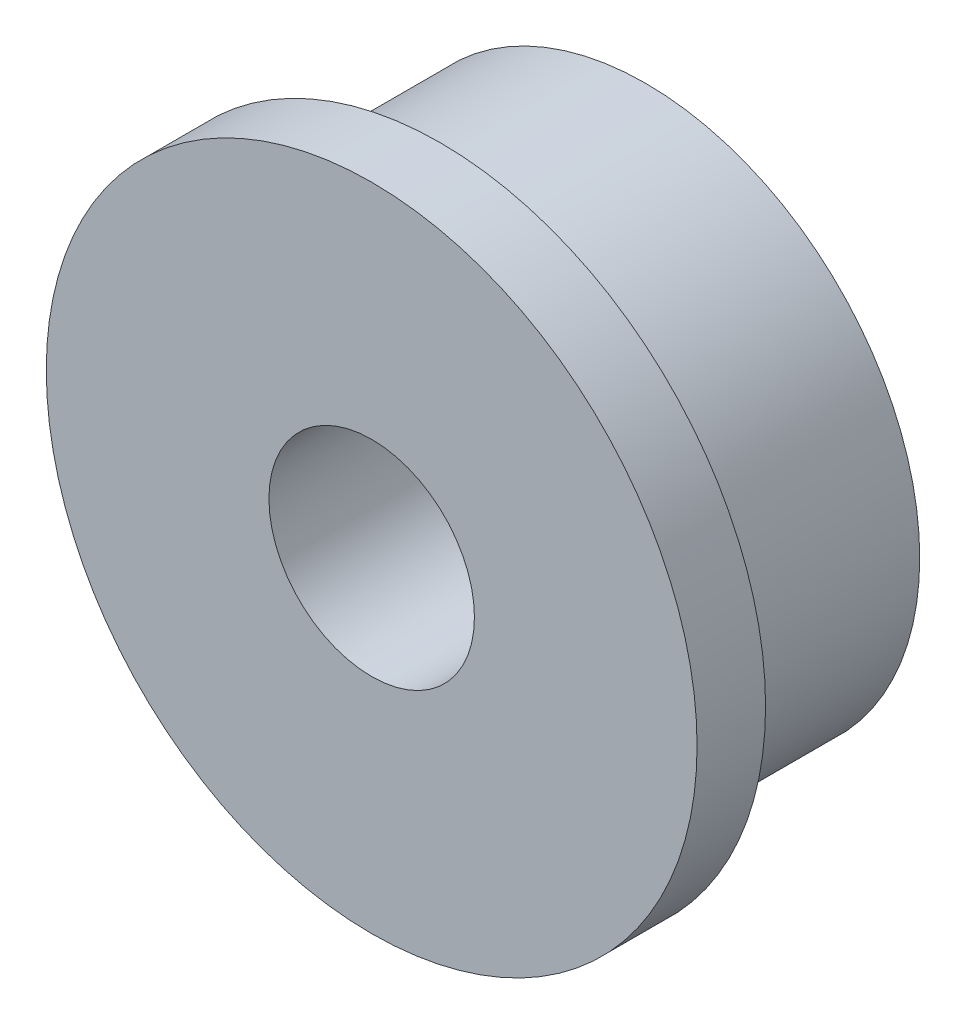
ISO-10303-21;
HEADER;
FILE_DESCRIPTION(('STEP AP214'),'2;1');
FILE_NAME('part.step','',(''),(''),'','','');
FILE_SCHEMA(('AUTOMOTIVE_DESIGN { 1 0 10303 214 1 1 1 1 }'));
ENDSEC;
DATA;
#1=APPLICATION_CONTEXT('core data for automotive mechanical design processes');
#2=APPLICATION_PROTOCOL_DEFINITION('international standard','automotive_design',2000,#1);
#3=PRODUCT_CONTEXT('',#1,'mechanical');
#4=PRODUCT('Part','Part','',(#3));
#5=PRODUCT_RELATED_PRODUCT_CATEGORY('part','',(#4));
#6=PRODUCT_DEFINITION_FORMATION('','',#4);
#7=PRODUCT_DEFINITION_CONTEXT('part definition',#1,'design');
#8=PRODUCT_DEFINITION('design','',#6,#7);
#9=PRODUCT_DEFINITION_SHAPE('','',#8);
#10=(LENGTH_UNIT() NAMED_UNIT(*) SI_UNIT(.MILLI.,.METRE.));
#11=(NAMED_UNIT(*) PLANE_ANGLE_UNIT() SI_UNIT($,.RADIAN.));
#12=(NAMED_UNIT(*) SI_UNIT($,.STERADIAN.) SOLID_ANGLE_UNIT());
#13=UNCERTAINTY_MEASURE_WITH_UNIT(LENGTH_MEASURE(1.E-05),#10,'distance_accuracy_value','');
#14=(GEOMETRIC_REPRESENTATION_CONTEXT(3) GLOBAL_UNCERTAINTY_ASSIGNED_CONTEXT((#13)) GLOBAL_UNIT_ASSIGNED_CONTEXT((#10,
#11,#12)) REPRESENTATION_CONTEXT('',''));
#15=CARTESIAN_POINT('',(0.,0.,0.));
#16=DIRECTION('',(0.,0.,1.));
#17=DIRECTION('',(1.,0.,0.));
#18=AXIS2_PLACEMENT_3D('',#15,#16,#17);
#19=CARTESIAN_POINT('',(0.,0.,0.));
#20=DIRECTION('',(0.,0.,1.));
#21=DIRECTION('',(1.,0.,0.));
#22=AXIS2_PLACEMENT_3D('',#19,#20,#21);
#23=PLANE('',#22);
#24=CARTESIAN_POINT('',(0.,0.,0.));
#25=DIRECTION('',(0.,0.,1.));
#26=DIRECTION('',(1.,0.,0.));
#27=AXIS2_PLACEMENT_3D('',#24,#25,#26);
#28=CIRCLE('',#27,4.);
#29=CARTESIAN_POINT('',(4.,0.,0.));
#30=VERTEX_POINT('',#29);
#31=EDGE_CURVE('E36',#30,#30,#28,.T.);
#32=ORIENTED_EDGE('',*,*,#31,.F.);
#33=EDGE_LOOP('',(#32));
#34=FACE_BOUND('',#33,.T.);
#35=CARTESIAN_POINT('',(0.,0.,0.));
#36=DIRECTION('',(0.,0.,1.));
#37=DIRECTION('',(1.,0.,0.));
#38=AXIS2_PLACEMENT_3D('',#35,#36,#37);
#39=CIRCLE('',#38,1.5);
#40=CARTESIAN_POINT('',(1.5,0.,0.));
#41=VERTEX_POINT('',#40);
#42=EDGE_CURVE('E43',#41,#41,#39,.T.);
#43=ORIENTED_EDGE('',*,*,#42,.T.);
#44=EDGE_LOOP('',(#43));
#45=FACE_BOUND('',#44,.T.);
#46=ADVANCED_FACE('F32',(#34,#45),#23,.F.);
#47=CARTESIAN_POINT('',(0.,0.,3.));
#48=DIRECTION('',(0.,0.,-1.));
#49=DIRECTION('',(-1.,0.,0.));
#50=AXIS2_PLACEMENT_3D('',#47,#48,#49);
#51=CYLINDRICAL_SURFACE('',#50,4.);
#52=CARTESIAN_POINT('',(0.,0.,3.));
#53=DIRECTION('',(0.,0.,1.));
#54=DIRECTION('',(1.,0.,0.));
#55=AXIS2_PLACEMENT_3D('',#52,#53,#54);
#56=CIRCLE('',#55,4.);
#57=CARTESIAN_POINT('',(4.,0.,3.));
#58=VERTEX_POINT('',#57);
#59=EDGE_CURVE('E10',#58,#58,#56,.T.);
#60=ORIENTED_EDGE('',*,*,#59,.F.);
#61=EDGE_LOOP('',(#60));
#62=FACE_BOUND('',#61,.T.);
#63=ORIENTED_EDGE('',*,*,#31,.T.);
#64=EDGE_LOOP('',(#63));
#65=FACE_BOUND('',#64,.T.);
#66=ADVANCED_FACE('F34',(#62,#65),#51,.T.);
#67=CARTESIAN_POINT('',(0.,0.,3.));
#68=DIRECTION('',(0.,0.,-1.));
#69=DIRECTION('',(-1.,0.,0.));
#70=AXIS2_PLACEMENT_3D('',#67,#68,#69);
#71=CYLINDRICAL_SURFACE('',#70,1.5);
#72=ORIENTED_EDGE('',*,*,#42,.F.);
#73=EDGE_LOOP('',(#72));
#74=FACE_BOUND('',#73,.T.);
#75=CARTESIAN_POINT('',(0.,0.,4.));
#76=DIRECTION('',(0.,0.,1.));
#77=DIRECTION('',(1.,0.,0.));
#78=AXIS2_PLACEMENT_3D('',#75,#76,#77);
#79=CIRCLE('',#78,1.5);
#80=CARTESIAN_POINT('',(1.5,0.,4.));
#81=VERTEX_POINT('',#80);
#82=EDGE_CURVE('E51',#81,#81,#79,.T.);
#83=ORIENTED_EDGE('',*,*,#82,.T.);
#84=EDGE_LOOP('',(#83));
#85=FACE_BOUND('',#84,.T.);
#86=ADVANCED_FACE('F57',(#74,#85),#71,.F.);
#87=CARTESIAN_POINT('',(0.,0.,4.));
#88=DIRECTION('',(0.,0.,1.));
#89=DIRECTION('',(1.,0.,0.));
#90=AXIS2_PLACEMENT_3D('',#87,#88,#89);
#91=PLANE('',#90);
#92=CARTESIAN_POINT('',(0.,0.,4.));
#93=DIRECTION('',(0.,0.,1.));
#94=DIRECTION('',(1.,0.,0.));
#95=AXIS2_PLACEMENT_3D('',#92,#93,#94);
#96=CIRCLE('',#95,4.75);
#97=CARTESIAN_POINT('',(4.75,0.,4.));
#98=VERTEX_POINT('',#97);
#99=EDGE_CURVE('E47',#98,#98,#96,.T.);
#100=ORIENTED_EDGE('',*,*,#99,.T.);
#101=EDGE_LOOP('',(#100));
#102=FACE_BOUND('',#101,.T.);
#103=ORIENTED_EDGE('',*,*,#82,.F.);
#104=EDGE_LOOP('',(#103));
#105=FACE_BOUND('',#104,.T.);
#106=ADVANCED_FACE('F59',(#102,#105),#91,.T.);
#107=CARTESIAN_POINT('',(0.,0.,3.));
#108=DIRECTION('',(0.,0.,1.));
#109=DIRECTION('',(1.,0.,0.));
#110=AXIS2_PLACEMENT_3D('',#107,#108,#109);
#111=PLANE('',#110);
#112=ORIENTED_EDGE('',*,*,#59,.T.);
#113=EDGE_LOOP('',(#112));
#114=FACE_BOUND('',#113,.T.);
#115=CARTESIAN_POINT('',(0.,0.,3.));
#116=DIRECTION('',(0.,0.,1.));
#117=DIRECTION('',(1.,0.,0.));
#118=AXIS2_PLACEMENT_3D('',#115,#116,#117);
#119=CIRCLE('',#118,4.75);
#120=CARTESIAN_POINT('',(4.75,0.,3.));
#121=VERTEX_POINT('',#120);
#122=EDGE_CURVE('E48',#121,#121,#119,.T.);
#123=ORIENTED_EDGE('',*,*,#122,.F.);
#124=EDGE_LOOP('',(#123));
#125=FACE_BOUND('',#124,.T.);
#126=ADVANCED_FACE('F61',(#114,#125),#111,.F.);
#127=CARTESIAN_POINT('',(0.,0.,4.));
#128=DIRECTION('',(0.,0.,-1.));
#129=DIRECTION('',(-1.,0.,0.));
#130=AXIS2_PLACEMENT_3D('',#127,#128,#129);
#131=CYLINDRICAL_SURFACE('',#130,4.75);
#132=ORIENTED_EDGE('',*,*,#99,.F.);
#133=EDGE_LOOP('',(#132));
#134=FACE_BOUND('',#133,.T.);
#135=ORIENTED_EDGE('',*,*,#122,.T.);
#136=EDGE_LOOP('',(#135));
#137=FACE_BOUND('',#136,.T.);
#138=ADVANCED_FACE('F68',(#134,#137),#131,.T.);
#139=CLOSED_SHELL('',(#46,#66,#86,#106,#126,#138));
#140=MANIFOLD_SOLID_BREP('B2',#139);
#141=ADVANCED_BREP_SHAPE_REPRESENTATION('',(#18,#140),#14);
#142=SHAPE_DEFINITION_REPRESENTATION(#9,#141);
ENDSEC;
END-ISO-10303-21;
